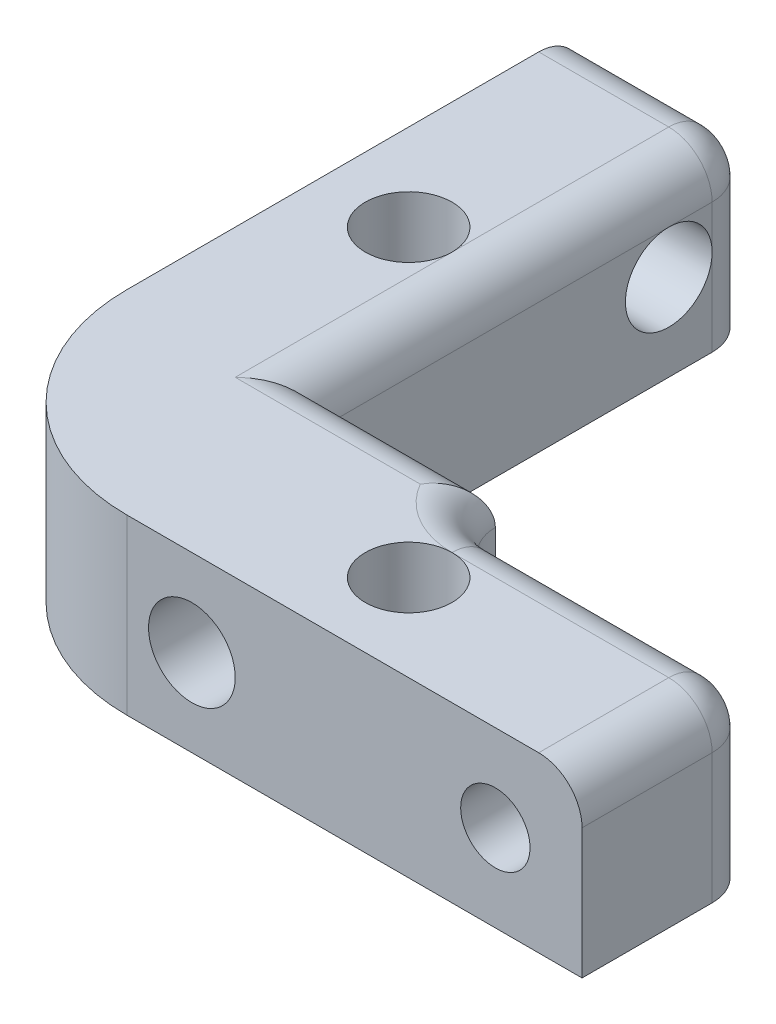
ISO-10303-21;
HEADER;
FILE_DESCRIPTION(('STEP AP214'),'2;1');
FILE_NAME('part.step','',(''),(''),'','','');
FILE_SCHEMA(('AUTOMOTIVE_DESIGN { 1 0 10303 214 1 1 1 1 }'));
ENDSEC;
DATA;
#1=APPLICATION_CONTEXT('core data for automotive mechanical design processes');
#2=APPLICATION_PROTOCOL_DEFINITION('international standard','automotive_design',2000,#1);
#3=PRODUCT_CONTEXT('',#1,'mechanical');
#4=PRODUCT('Part','Part','',(#3));
#5=PRODUCT_RELATED_PRODUCT_CATEGORY('part','',(#4));
#6=PRODUCT_DEFINITION_FORMATION('','',#4);
#7=PRODUCT_DEFINITION_CONTEXT('part definition',#1,'design');
#8=PRODUCT_DEFINITION('design','',#6,#7);
#9=PRODUCT_DEFINITION_SHAPE('','',#8);
#10=(LENGTH_UNIT() NAMED_UNIT(*) SI_UNIT(.MILLI.,.METRE.));
#11=(NAMED_UNIT(*) PLANE_ANGLE_UNIT() SI_UNIT($,.RADIAN.));
#12=(NAMED_UNIT(*) SI_UNIT($,.STERADIAN.) SOLID_ANGLE_UNIT());
#13=UNCERTAINTY_MEASURE_WITH_UNIT(LENGTH_MEASURE(1.E-05),#10,'distance_accuracy_value','');
#14=(GEOMETRIC_REPRESENTATION_CONTEXT(3) GLOBAL_UNCERTAINTY_ASSIGNED_CONTEXT((#13)) GLOBAL_UNIT_ASSIGNED_CONTEXT((#10,
#11,#12)) REPRESENTATION_CONTEXT('',''));
#15=CARTESIAN_POINT('',(0.,0.,0.));
#16=DIRECTION('',(0.,0.,1.));
#17=DIRECTION('',(1.,0.,0.));
#18=AXIS2_PLACEMENT_3D('',#15,#16,#17);
#19=CARTESIAN_POINT('',(0.,6.,-8.));
#20=DIRECTION('',(1.,0.,0.));
#21=DIRECTION('',(0.,0.,1.));
#22=AXIS2_PLACEMENT_3D('',#19,#20,#21);
#23=CYLINDRICAL_SURFACE('',#22,2.);
#24=CARTESIAN_POINT('',(6.,6.,-8.));
#25=DIRECTION('',(-0.707106781186547,0.,-0.707106781186548));
#26=DIRECTION('',(0.707106781186548,0.,-0.707106781186547));
#27=AXIS2_PLACEMENT_3D('',#24,#25,#26);
#28=ELLIPSE('',#27,2.82842712474619,2.);
#29=CARTESIAN_POINT('',(8.,6.,-10.));
#30=VERTEX_POINT('',#29);
#31=CARTESIAN_POINT('',(6.,8.,-8.));
#32=VERTEX_POINT('',#31);
#33=EDGE_CURVE('E179',#30,#32,#28,.F.);
#34=ORIENTED_EDGE('',*,*,#33,.T.);
#35=DIRECTION('',(-1.,0.,0.));
#36=VECTOR('',#35,1.);
#37=CARTESIAN_POINT('',(16.,8.,-8.));
#38=LINE('',#37,#36);
#39=CARTESIAN_POINT('',(14.5358983848622,8.,-8.));
#40=VERTEX_POINT('',#39);
#41=EDGE_CURVE('E348',#32,#40,#38,.F.);
#42=ORIENTED_EDGE('',*,*,#41,.T.);
#43=CARTESIAN_POINT('',(14.5358983848622,8.,-8.));
#44=CARTESIAN_POINT('',(14.5375001824375,8.00000002209721,-8.0027744178466));
#45=CARTESIAN_POINT('',(14.5391028942597,7.99999424836433,-8.00554847099654));
#46=CARTESIAN_POINT('',(14.625864841651,7.99936864803302,-8.15561478811584));
#47=CARTESIAN_POINT('',(14.7135730795539,7.98242889649205,-8.30181855401064));
#48=CARTESIAN_POINT('',(14.8914272804067,7.91775844511564,-8.58617890631636));
#49=CARTESIAN_POINT('',(14.9815813571992,7.86990895227149,-8.72430219466688));
#50=CARTESIAN_POINT('',(15.1518529762845,7.75186419444566,-8.97363448444823));
#51=CARTESIAN_POINT('',(15.2320382829593,7.68451386831143,-9.08614843543818));
#52=CARTESIAN_POINT('',(15.3890326338001,7.52787635455287,-9.29724182069926));
#53=CARTESIAN_POINT('',(15.465847178763,7.43862660343163,-9.39584458742172));
#54=CARTESIAN_POINT('',(15.5950234986144,7.26222042888166,-9.55481481391088));
#55=CARTESIAN_POINT('',(15.6489227442374,7.17938601622185,-9.61874492625438));
#56=CARTESIAN_POINT('',(15.7494480077157,7.00156465967341,-9.73438111148855));
#57=CARTESIAN_POINT('',(15.7960826121481,6.90659230801682,-9.78610165357081));
#58=CARTESIAN_POINT('',(15.8686073309647,6.7284656554436,-9.86454411726075));
#59=CARTESIAN_POINT('',(15.8968024290323,6.6475823092866,-9.8942783148596));
#60=CARTESIAN_POINT('',(15.9440557721517,6.48029934945976,-9.94341411816275));
#61=CARTESIAN_POINT('',(15.9631401555952,6.39391633226238,-9.96284530090678));
#62=CARTESIAN_POINT('',(15.9842872083708,6.25568014900519,-9.98424053448558));
#63=CARTESIAN_POINT('',(15.9901408879265,6.20497641338193,-9.99012309445256));
#64=CARTESIAN_POINT('',(15.9980134230023,6.10286316456792,-9.99801367061352));
#65=CARTESIAN_POINT('',(16.0000237902505,6.05145234115789,-10.0000131107714));
#66=CARTESIAN_POINT('',(16.,6.,-10.));
#67=B_SPLINE_CURVE_WITH_KNOTS('',3,(#43,#44,#45,#46,#47,#48,#49,#50,#51,#52,#53,#54,#55,#56,#57,
#58,#59,#60,#61,#62,#63,#64,#65,#66),.UNSPECIFIED.,.F.,.F.,(4,2,2,2,2,2,2,2,2,2,2,4),(0.,
0.00961126168696794,0.520007135459454,1.03237633923822,1.49140460861737,1.94965358203387,
2.30154353440882,2.65301435541076,2.92403339153315,3.19427013774113,3.34813507965423,
3.50233945415597),.UNSPECIFIED.);
#68=CARTESIAN_POINT('',(16.,6.,-10.));
#69=VERTEX_POINT('',#68);
#70=EDGE_CURVE('E12',#40,#69,#67,.T.);
#71=ORIENTED_EDGE('',*,*,#70,.T.);
#72=DIRECTION('',(-1.,0.,0.));
#73=VECTOR('',#72,1.);
#74=CARTESIAN_POINT('',(6.,6.,-10.));
#75=LINE('',#74,#73);
#76=EDGE_CURVE('E169',#69,#30,#75,.T.);
#77=ORIENTED_EDGE('',*,*,#76,.T.);
#78=EDGE_LOOP('',(#34,#42,#71,#77));
#79=FACE_BOUND('',#78,.T.);
#80=ADVANCED_FACE('F38',(#79),#23,.T.);
#81=CARTESIAN_POINT('',(18.,6.,-10.));
#82=DIRECTION('',(0.,1.,0.));
#83=DIRECTION('',(0.,0.,-1.));
#84=AXIS2_PLACEMENT_3D('',#81,#82,#83);
#85=TOROIDAL_SURFACE('',#84,4.,2.);
#86=CARTESIAN_POINT('',(18.,8.,-10.));
#87=DIRECTION('',(0.,-1.,0.));
#88=DIRECTION('',(0.,0.,-1.));
#89=AXIS2_PLACEMENT_3D('',#86,#87,#88);
#90=CIRCLE('',#89,4.);
#91=CARTESIAN_POINT('',(18.,8.,-6.));
#92=VERTEX_POINT('',#91);
#93=EDGE_CURVE('E58',#92,#40,#90,.T.);
#94=ORIENTED_EDGE('',*,*,#93,.F.);
#95=CARTESIAN_POINT('',(18.,6.,-6.));
#96=DIRECTION('',(1.,0.,0.));
#97=DIRECTION('',(0.,0.,-1.));
#98=AXIS2_PLACEMENT_3D('',#95,#96,#97);
#99=CIRCLE('',#98,2.);
#100=CARTESIAN_POINT('',(18.,6.,-8.));
#101=VERTEX_POINT('',#100);
#102=EDGE_CURVE('E360',#92,#101,#99,.F.);
#103=ORIENTED_EDGE('',*,*,#102,.T.);
#104=CARTESIAN_POINT('',(18.,6.,-10.));
#105=DIRECTION('',(0.,-1.,0.));
#106=DIRECTION('',(0.,0.,-1.));
#107=AXIS2_PLACEMENT_3D('',#104,#105,#106);
#108=CIRCLE('',#107,2.);
#109=EDGE_CURVE('E331',#69,#101,#108,.F.);
#110=ORIENTED_EDGE('',*,*,#109,.F.);
#111=ORIENTED_EDGE('',*,*,#70,.F.);
#112=EDGE_LOOP('',(#94,#103,#110,#111));
#113=FACE_BOUND('',#112,.T.);
#114=ADVANCED_FACE('F364',(#113),#85,.T.);
#115=CARTESIAN_POINT('',(30.,8.,-8.));
#116=DIRECTION('',(0.,0.,-1.));
#117=DIRECTION('',(1.,0.,0.));
#118=AXIS2_PLACEMENT_3D('',#115,#116,#117);
#119=PLANE('',#118);
#120=DIRECTION('',(0.,-1.,0.));
#121=VECTOR('',#120,1.);
#122=CARTESIAN_POINT('',(28.,8.,-8.));
#123=LINE('',#122,#121);
#124=CARTESIAN_POINT('',(28.,4.,-8.));
#125=VERTEX_POINT('',#124);
#126=CARTESIAN_POINT('',(28.,6.,-8.));
#127=VERTEX_POINT('',#126);
#128=EDGE_CURVE('E292',#125,#127,#123,.F.);
#129=ORIENTED_EDGE('',*,*,#128,.F.);
#130=CARTESIAN_POINT('',(26.,4.,-8.));
#131=DIRECTION('',(0.,0.,1.));
#132=DIRECTION('',(1.,0.,0.));
#133=AXIS2_PLACEMENT_3D('',#130,#131,#132);
#134=CIRCLE('',#133,2.);
#135=CARTESIAN_POINT('',(26.,6.,-8.));
#136=VERTEX_POINT('',#135);
#137=EDGE_CURVE('E207',#125,#136,#134,.T.);
#138=ORIENTED_EDGE('',*,*,#137,.T.);
#139=DIRECTION('',(-1.,0.,0.));
#140=VECTOR('',#139,1.);
#141=CARTESIAN_POINT('',(30.,6.,-8.));
#142=LINE('',#141,#140);
#143=EDGE_CURVE('E345',#127,#136,#142,.T.);
#144=ORIENTED_EDGE('',*,*,#143,.F.);
#145=EDGE_LOOP('',(#129,#138,#144));
#146=FACE_BOUND('',#145,.T.);
#147=ADVANCED_FACE('F432',(#146),#119,.T.);
#148=CARTESIAN_POINT('',(8.,8.,-9.00000000000006));
#149=DIRECTION('',(1.,0.,0.));
#150=DIRECTION('',(0.,0.,1.));
#151=AXIS2_PLACEMENT_3D('',#148,#149,#150);
#152=PLANE('',#151);
#153=CARTESIAN_POINT('',(8.00000000000001,4.,-26.));
#154=DIRECTION('',(1.,0.,0.));
#155=DIRECTION('',(0.,0.,-1.));
#156=AXIS2_PLACEMENT_3D('',#153,#154,#155);
#157=CIRCLE('',#156,2.);
#158=CARTESIAN_POINT('',(8.00000000000001,6.,-26.));
#159=VERTEX_POINT('',#158);
#160=CARTESIAN_POINT('',(8.00000000000001,4.,-28.));
#161=VERTEX_POINT('',#160);
#162=EDGE_CURVE('E189',#159,#161,#157,.T.);
#163=ORIENTED_EDGE('',*,*,#162,.F.);
#164=DIRECTION('',(0.,0.,-1.));
#165=VECTOR('',#164,1.);
#166=CARTESIAN_POINT('',(8.,6.,-9.00000000000006));
#167=LINE('',#166,#165);
#168=EDGE_CURVE('E311',#30,#159,#167,.T.);
#169=ORIENTED_EDGE('',*,*,#168,.F.);
#170=DIRECTION('',(0.,-1.,0.));
#171=VECTOR('',#170,1.);
#172=CARTESIAN_POINT('',(8.,8.,-10.));
#173=LINE('',#172,#171);
#174=CARTESIAN_POINT('',(8.,0.,-10.));
#175=VERTEX_POINT('',#174);
#176=EDGE_CURVE('E187',#30,#175,#173,.T.);
#177=ORIENTED_EDGE('',*,*,#176,.T.);
#178=DIRECTION('',(0.,0.,-1.));
#179=VECTOR('',#178,1.);
#180=CARTESIAN_POINT('',(8.,0.,-9.00000000000006));
#181=LINE('',#180,#179);
#182=CARTESIAN_POINT('',(8.,0.,-28.));
#183=VERTEX_POINT('',#182);
#184=EDGE_CURVE('E185',#175,#183,#181,.T.);
#185=ORIENTED_EDGE('',*,*,#184,.T.);
#186=DIRECTION('',(0.,-1.,0.));
#187=VECTOR('',#186,1.);
#188=CARTESIAN_POINT('',(8.,8.,-28.));
#189=LINE('',#188,#187);
#190=EDGE_CURVE('E316',#161,#183,#189,.T.);
#191=ORIENTED_EDGE('',*,*,#190,.F.);
#192=EDGE_LOOP('',(#163,#169,#177,#185,#191));
#193=FACE_BOUND('',#192,.T.);
#194=ADVANCED_FACE('F408',(#193),#152,.T.);
#195=CARTESIAN_POINT('',(12.,4.,0.));
#196=DIRECTION('',(0.,0.,-1.));
#197=DIRECTION('',(1.,0.,0.));
#198=AXIS2_PLACEMENT_3D('',#195,#196,#197);
#199=CYLINDRICAL_SURFACE('',#198,1.6);
#200=CARTESIAN_POINT('',(12.,4.,-10.));
#201=DIRECTION('',(0.,0.,-1.));
#202=DIRECTION('',(-1.,0.,0.));
#203=AXIS2_PLACEMENT_3D('',#200,#201,#202);
#204=CIRCLE('',#203,1.6);
#205=CARTESIAN_POINT('',(10.4,4.,-10.));
#206=VERTEX_POINT('',#205);
#207=EDGE_CURVE('E170',#206,#206,#204,.T.);
#208=ORIENTED_EDGE('',*,*,#207,.T.);
#209=EDGE_LOOP('',(#208));
#210=FACE_BOUND('',#209,.T.);
#211=CARTESIAN_POINT('',(12.,4.,-7.5));
#212=DIRECTION('',(0.,0.,-1.));
#213=DIRECTION('',(-1.,0.,0.));
#214=AXIS2_PLACEMENT_3D('',#211,#212,#213);
#215=CIRCLE('',#214,1.6);
#216=CARTESIAN_POINT('',(10.4,4.,-7.5));
#217=VERTEX_POINT('',#216);
#218=EDGE_CURVE('E279',#217,#217,#215,.F.);
#219=ORIENTED_EDGE('',*,*,#218,.T.);
#220=EDGE_LOOP('',(#219));
#221=FACE_BOUND('',#220,.T.);
#222=ADVANCED_FACE('F741',(#210,#221),#199,.F.);
#223=DIRECTION('',(0.,0.,-1.));
#224=VECTOR('',#223,1.);
#225=CARTESIAN_POINT('',(8.,6.,-9.00000000000006));
#226=LINE('',#225,#224);
#227=CARTESIAN_POINT('',(8.,6.,-28.));
#228=VERTEX_POINT('',#227);
#229=EDGE_CURVE('E308',#159,#228,#226,.T.);
#230=ORIENTED_EDGE('',*,*,#229,.F.);
#231=EDGE_CURVE('E197',#161,#159,#157,.T.);
#232=ORIENTED_EDGE('',*,*,#231,.F.);
#233=DIRECTION('',(0.,-1.,0.));
#234=VECTOR('',#233,1.);
#235=CARTESIAN_POINT('',(8.,8.,-28.));
#236=LINE('',#235,#234);
#237=EDGE_CURVE('E314',#228,#161,#236,.T.);
#238=ORIENTED_EDGE('',*,*,#237,.F.);
#239=EDGE_LOOP('',(#230,#232,#238));
#240=FACE_BOUND('',#239,.T.);
#241=ADVANCED_FACE('F743',(#240),#152,.T.);
#242=CARTESIAN_POINT('',(30.001,4.,-26.));
#243=DIRECTION('',(-1.,0.,0.));
#244=DIRECTION('',(0.,0.,-1.));
#245=AXIS2_PLACEMENT_3D('',#242,#243,#244);
#246=CYLINDRICAL_SURFACE('',#245,1.6);
#247=CARTESIAN_POINT('',(0.,4.,-26.));
#248=DIRECTION('',(-1.,0.,0.));
#249=DIRECTION('',(0.,0.,1.));
#250=AXIS2_PLACEMENT_3D('',#247,#248,#249);
#251=CIRCLE('',#250,1.6);
#252=CARTESIAN_POINT('',(0.,4.,-24.4));
#253=VERTEX_POINT('',#252);
#254=EDGE_CURVE('E199',#253,#253,#251,.T.);
#255=ORIENTED_EDGE('',*,*,#254,.T.);
#256=EDGE_LOOP('',(#255));
#257=FACE_BOUND('',#256,.T.);
#258=CARTESIAN_POINT('',(2.50000000000001,4.,-26.));
#259=DIRECTION('',(-1.,0.,0.));
#260=DIRECTION('',(0.,0.,1.));
#261=AXIS2_PLACEMENT_3D('',#258,#259,#260);
#262=CIRCLE('',#261,1.6);
#263=CARTESIAN_POINT('',(2.50000000000001,4.,-24.4));
#264=VERTEX_POINT('',#263);
#265=EDGE_CURVE('E196',#264,#264,#262,.T.);
#266=ORIENTED_EDGE('',*,*,#265,.F.);
#267=EDGE_LOOP('',(#266));
#268=FACE_BOUND('',#267,.T.);
#269=ADVANCED_FACE('F493',(#257,#268),#246,.F.);
#270=CARTESIAN_POINT('',(26.,4.,-30.001));
#271=DIRECTION('',(0.,0.,1.));
#272=DIRECTION('',(-1.,0.,0.));
#273=AXIS2_PLACEMENT_3D('',#270,#271,#272);
#274=CYLINDRICAL_SURFACE('',#273,1.6);
#275=CARTESIAN_POINT('',(26.,4.,0.));
#276=DIRECTION('',(0.,0.,-1.));
#277=DIRECTION('',(-1.,0.,0.));
#278=AXIS2_PLACEMENT_3D('',#275,#276,#277);
#279=CIRCLE('',#278,1.6);
#280=CARTESIAN_POINT('',(24.4,4.,0.));
#281=VERTEX_POINT('',#280);
#282=EDGE_CURVE('E210',#281,#281,#279,.T.);
#283=ORIENTED_EDGE('',*,*,#282,.F.);
#284=EDGE_LOOP('',(#283));
#285=FACE_BOUND('',#284,.T.);
#286=CARTESIAN_POINT('',(26.,4.,-2.5));
#287=DIRECTION('',(0.,0.,1.));
#288=DIRECTION('',(1.,0.,0.));
#289=AXIS2_PLACEMENT_3D('',#286,#287,#288);
#290=CIRCLE('',#289,1.6);
#291=CARTESIAN_POINT('',(27.6,4.,-2.5));
#292=VERTEX_POINT('',#291);
#293=EDGE_CURVE('E206',#292,#292,#290,.F.);
#294=ORIENTED_EDGE('',*,*,#293,.T.);
#295=EDGE_LOOP('',(#294));
#296=FACE_BOUND('',#295,.T.);
#297=ADVANCED_FACE('F489',(#285,#296),#274,.F.);
#298=CARTESIAN_POINT('',(4.00000000000001,8.001,-18.));
#299=DIRECTION('',(0.,-1.,0.));
#300=DIRECTION('',(0.,0.,1.));
#301=AXIS2_PLACEMENT_3D('',#298,#299,#300);
#302=CYLINDRICAL_SURFACE('',#301,1.6);
#303=CARTESIAN_POINT('',(4.00000000000001,0.,-18.));
#304=DIRECTION('',(0.,1.,0.));
#305=DIRECTION('',(0.,0.,1.));
#306=AXIS2_PLACEMENT_3D('',#303,#304,#305);
#307=CIRCLE('',#306,1.6);
#308=CARTESIAN_POINT('',(4.00000000000001,0.,-16.4));
#309=VERTEX_POINT('',#308);
#310=EDGE_CURVE('E229',#309,#309,#307,.T.);
#311=ORIENTED_EDGE('',*,*,#310,.F.);
#312=EDGE_LOOP('',(#311));
#313=FACE_BOUND('',#312,.T.);
#314=CARTESIAN_POINT('',(4.00000000000001,2.5,-18.));
#315=DIRECTION('',(0.,-1.,0.));
#316=DIRECTION('',(0.,0.,-1.));
#317=AXIS2_PLACEMENT_3D('',#314,#315,#316);
#318=CIRCLE('',#317,1.6);
#319=CARTESIAN_POINT('',(4.00000000000001,2.5,-19.6));
#320=VERTEX_POINT('',#319);
#321=EDGE_CURVE('E232',#320,#320,#318,.F.);
#322=ORIENTED_EDGE('',*,*,#321,.T.);
#323=EDGE_LOOP('',(#322));
#324=FACE_BOUND('',#323,.T.);
#325=ADVANCED_FACE('F492',(#313,#324),#302,.F.);
#326=CARTESIAN_POINT('',(18.,8.001,-4.));
#327=DIRECTION('',(0.,-1.,0.));
#328=DIRECTION('',(0.,0.,1.));
#329=AXIS2_PLACEMENT_3D('',#326,#327,#328);
#330=CYLINDRICAL_SURFACE('',#329,1.6);
#331=CARTESIAN_POINT('',(18.,0.,-4.));
#332=DIRECTION('',(0.,1.,0.));
#333=DIRECTION('',(0.,0.,1.));
#334=AXIS2_PLACEMENT_3D('',#331,#332,#333);
#335=CIRCLE('',#334,1.6);
#336=CARTESIAN_POINT('',(18.,0.,-2.4));
#337=VERTEX_POINT('',#336);
#338=EDGE_CURVE('E225',#337,#337,#335,.T.);
#339=ORIENTED_EDGE('',*,*,#338,.F.);
#340=EDGE_LOOP('',(#339));
#341=FACE_BOUND('',#340,.T.);
#342=CARTESIAN_POINT('',(18.,2.5,-4.));
#343=DIRECTION('',(0.,-1.,0.));
#344=DIRECTION('',(0.,0.,-1.));
#345=AXIS2_PLACEMENT_3D('',#342,#343,#344);
#346=CIRCLE('',#345,1.6);
#347=CARTESIAN_POINT('',(18.,2.5,-5.6));
#348=VERTEX_POINT('',#347);
#349=EDGE_CURVE('E217',#348,#348,#346,.F.);
#350=ORIENTED_EDGE('',*,*,#349,.T.);
#351=EDGE_LOOP('',(#350));
#352=FACE_BOUND('',#351,.T.);
#353=ADVANCED_FACE('F509',(#341,#352),#330,.F.);
#354=CARTESIAN_POINT('',(0.,8.,-9.00000000000006));
#355=DIRECTION('',(1.,0.,0.));
#356=DIRECTION('',(0.,0.,1.));
#357=AXIS2_PLACEMENT_3D('',#354,#355,#356);
#358=PLANE('',#357);
#359=ORIENTED_EDGE('',*,*,#254,.F.);
#360=EDGE_LOOP('',(#359));
#361=FACE_BOUND('',#360,.T.);
#362=DIRECTION('',(0.,-1.,0.));
#363=VECTOR('',#362,1.);
#364=CARTESIAN_POINT('',(0.,8.,-30.));
#365=LINE('',#364,#363);
#366=CARTESIAN_POINT('',(0.,6.,-30.));
#367=VERTEX_POINT('',#366);
#368=CARTESIAN_POINT('',(0.,0.,-30.));
#369=VERTEX_POINT('',#368);
#370=EDGE_CURVE('E265',#367,#369,#365,.T.);
#371=ORIENTED_EDGE('',*,*,#370,.T.);
#372=DIRECTION('',(0.,0.,-1.));
#373=VECTOR('',#372,1.);
#374=CARTESIAN_POINT('',(0.,0.,-9.00000000000006));
#375=LINE('',#374,#373);
#376=CARTESIAN_POINT('',(0.,0.,-9.00000000000006));
#377=VERTEX_POINT('',#376);
#378=EDGE_CURVE('E228',#377,#369,#375,.T.);
#379=ORIENTED_EDGE('',*,*,#378,.F.);
#380=DIRECTION('',(0.,-1.,0.));
#381=VECTOR('',#380,1.);
#382=CARTESIAN_POINT('',(0.,8.,-9.00000000000006));
#383=LINE('',#382,#381);
#384=CARTESIAN_POINT('',(0.,8.,-9.00000000000006));
#385=VERTEX_POINT('',#384);
#386=EDGE_CURVE('E242',#385,#377,#383,.T.);
#387=ORIENTED_EDGE('',*,*,#386,.F.);
#388=DIRECTION('',(0.,0.,-1.));
#389=VECTOR('',#388,1.);
#390=CARTESIAN_POINT('',(0.,8.,-9.00000000000006));
#391=LINE('',#390,#389);
#392=CARTESIAN_POINT('',(0.,8.,-28.));
#393=VERTEX_POINT('',#392);
#394=EDGE_CURVE('E233',#385,#393,#391,.T.);
#395=ORIENTED_EDGE('',*,*,#394,.T.);
#396=CARTESIAN_POINT('',(0.,6.,-28.));
#397=DIRECTION('',(-1.,0.,0.));
#398=DIRECTION('',(0.,0.,1.));
#399=AXIS2_PLACEMENT_3D('',#396,#397,#398);
#400=CIRCLE('',#399,2.);
#401=EDGE_CURVE('E324',#367,#393,#400,.F.);
#402=ORIENTED_EDGE('',*,*,#401,.F.);
#403=EDGE_LOOP('',(#371,#379,#387,#395,#402));
#404=FACE_BOUND('',#403,.T.);
#405=ADVANCED_FACE('F393',(#361,#404),#358,.F.);
#406=CARTESIAN_POINT('',(8.,8.,-30.));
#407=DIRECTION('',(0.,0.,-1.));
#408=DIRECTION('',(1.,0.,0.));
#409=AXIS2_PLACEMENT_3D('',#406,#407,#408);
#410=PLANE('',#409);
#411=DIRECTION('',(-1.,0.,0.));
#412=VECTOR('',#411,1.);
#413=CARTESIAN_POINT('',(8.,0.,-30.));
#414=LINE('',#413,#412);
#415=CARTESIAN_POINT('',(6.,0.,-30.));
#416=VERTEX_POINT('',#415);
#417=EDGE_CURVE('E245',#416,#369,#414,.T.);
#418=ORIENTED_EDGE('',*,*,#417,.T.);
#419=ORIENTED_EDGE('',*,*,#370,.F.);
#420=DIRECTION('',(-1.,0.,0.));
#421=VECTOR('',#420,1.);
#422=CARTESIAN_POINT('',(8.,6.,-30.));
#423=LINE('',#422,#421);
#424=CARTESIAN_POINT('',(6.,6.,-30.));
#425=VERTEX_POINT('',#424);
#426=EDGE_CURVE('E319',#425,#367,#423,.T.);
#427=ORIENTED_EDGE('',*,*,#426,.F.);
#428=DIRECTION('',(0.,-1.,0.));
#429=VECTOR('',#428,1.);
#430=CARTESIAN_POINT('',(6.,8.,-30.));
#431=LINE('',#430,#429);
#432=EDGE_CURVE('E321',#416,#425,#431,.F.);
#433=ORIENTED_EDGE('',*,*,#432,.F.);
#434=EDGE_LOOP('',(#418,#419,#427,#433));
#435=FACE_BOUND('',#434,.T.);
#436=ADVANCED_FACE('F398',(#435),#410,.T.);
#437=EDGE_CURVE('E202',#136,#125,#134,.T.);
#438=ORIENTED_EDGE('',*,*,#437,.T.);
#439=DIRECTION('',(0.,-1.,0.));
#440=VECTOR('',#439,1.);
#441=CARTESIAN_POINT('',(28.,8.,-8.));
#442=LINE('',#441,#440);
#443=CARTESIAN_POINT('',(28.,0.,-8.));
#444=VERTEX_POINT('',#443);
#445=EDGE_CURVE('E295',#444,#125,#442,.F.);
#446=ORIENTED_EDGE('',*,*,#445,.F.);
#447=DIRECTION('',(-1.,0.,0.));
#448=VECTOR('',#447,1.);
#449=CARTESIAN_POINT('',(30.,0.,-8.));
#450=LINE('',#449,#448);
#451=CARTESIAN_POINT('',(18.,0.,-8.));
#452=VERTEX_POINT('',#451);
#453=EDGE_CURVE('E248',#444,#452,#450,.T.);
#454=ORIENTED_EDGE('',*,*,#453,.T.);
#455=DIRECTION('',(0.,-1.,0.));
#456=VECTOR('',#455,1.);
#457=CARTESIAN_POINT('',(18.,0.,-8.));
#458=LINE('',#457,#456);
#459=EDGE_CURVE('E175',#101,#452,#458,.T.);
#460=ORIENTED_EDGE('',*,*,#459,.F.);
#461=DIRECTION('',(-1.,0.,0.));
#462=VECTOR('',#461,1.);
#463=CARTESIAN_POINT('',(30.,6.,-8.));
#464=LINE('',#463,#462);
#465=EDGE_CURVE('E343',#136,#101,#464,.T.);
#466=ORIENTED_EDGE('',*,*,#465,.F.);
#467=EDGE_LOOP('',(#438,#446,#454,#460,#466));
#468=FACE_BOUND('',#467,.T.);
#469=ADVANCED_FACE('F372',(#468),#119,.T.);
#470=CARTESIAN_POINT('',(30.,8.,0.));
#471=DIRECTION('',(1.,0.,0.));
#472=DIRECTION('',(0.,0.,1.));
#473=AXIS2_PLACEMENT_3D('',#470,#471,#472);
#474=PLANE('',#473);
#475=DIRECTION('',(0.,0.,-1.));
#476=VECTOR('',#475,1.);
#477=CARTESIAN_POINT('',(30.,6.,0.));
#478=LINE('',#477,#476);
#479=CARTESIAN_POINT('',(30.,6.,0.));
#480=VERTEX_POINT('',#479);
#481=CARTESIAN_POINT('',(30.,6.,-6.));
#482=VERTEX_POINT('',#481);
#483=EDGE_CURVE('E268',#480,#482,#478,.T.);
#484=ORIENTED_EDGE('',*,*,#483,.F.);
#485=DIRECTION('',(0.,-1.,0.));
#486=VECTOR('',#485,1.);
#487=CARTESIAN_POINT('',(30.,8.,0.));
#488=LINE('',#487,#486);
#489=CARTESIAN_POINT('',(30.,0.,0.));
#490=VERTEX_POINT('',#489);
#491=EDGE_CURVE('E262',#480,#490,#488,.T.);
#492=ORIENTED_EDGE('',*,*,#491,.T.);
#493=DIRECTION('',(0.,0.,-1.));
#494=VECTOR('',#493,1.);
#495=CARTESIAN_POINT('',(30.,0.,0.));
#496=LINE('',#495,#494);
#497=CARTESIAN_POINT('',(30.,0.,-6.));
#498=VERTEX_POINT('',#497);
#499=EDGE_CURVE('E250',#490,#498,#496,.T.);
#500=ORIENTED_EDGE('',*,*,#499,.T.);
#501=DIRECTION('',(0.,-1.,0.));
#502=VECTOR('',#501,1.);
#503=CARTESIAN_POINT('',(30.,8.,-6.));
#504=LINE('',#503,#502);
#505=EDGE_CURVE('E285',#482,#498,#504,.T.);
#506=ORIENTED_EDGE('',*,*,#505,.F.);
#507=EDGE_LOOP('',(#484,#492,#500,#506));
#508=FACE_BOUND('',#507,.T.);
#509=ADVANCED_FACE('F379',(#508),#474,.T.);
#510=CARTESIAN_POINT('',(30.,8.,0.));
#511=DIRECTION('',(0.,0.,-1.));
#512=DIRECTION('',(1.,0.,0.));
#513=AXIS2_PLACEMENT_3D('',#510,#511,#512);
#514=PLANE('',#513);
#515=CARTESIAN_POINT('',(12.,4.,0.));
#516=DIRECTION('',(0.,0.,1.));
#517=DIRECTION('',(1.,0.,0.));
#518=AXIS2_PLACEMENT_3D('',#515,#516,#517);
#519=CIRCLE('',#518,2.);
#520=CARTESIAN_POINT('',(14.,4.,0.));
#521=VERTEX_POINT('',#520);
#522=EDGE_CURVE('E336',#521,#521,#519,.T.);
#523=ORIENTED_EDGE('',*,*,#522,.F.);
#524=EDGE_LOOP('',(#523));
#525=FACE_BOUND('',#524,.T.);
#526=ORIENTED_EDGE('',*,*,#282,.T.);
#527=EDGE_LOOP('',(#526));
#528=FACE_BOUND('',#527,.T.);
#529=DIRECTION('',(-1.,0.,0.));
#530=VECTOR('',#529,1.);
#531=CARTESIAN_POINT('',(30.,8.,0.));
#532=LINE('',#531,#530);
#533=CARTESIAN_POINT('',(28.,8.,0.));
#534=VERTEX_POINT('',#533);
#535=CARTESIAN_POINT('',(9.00000000000006,8.,0.));
#536=VERTEX_POINT('',#535);
#537=EDGE_CURVE('E236',#534,#536,#532,.T.);
#538=ORIENTED_EDGE('',*,*,#537,.T.);
#539=DIRECTION('',(0.,-1.,0.));
#540=VECTOR('',#539,1.);
#541=CARTESIAN_POINT('',(9.00000000000006,8.,0.));
#542=LINE('',#541,#540);
#543=CARTESIAN_POINT('',(9.00000000000006,0.,0.));
#544=VERTEX_POINT('',#543);
#545=EDGE_CURVE('E259',#536,#544,#542,.T.);
#546=ORIENTED_EDGE('',*,*,#545,.T.);
#547=DIRECTION('',(-1.,0.,0.));
#548=VECTOR('',#547,1.);
#549=CARTESIAN_POINT('',(30.,0.,0.));
#550=LINE('',#549,#548);
#551=EDGE_CURVE('E253',#490,#544,#550,.T.);
#552=ORIENTED_EDGE('',*,*,#551,.F.);
#553=ORIENTED_EDGE('',*,*,#491,.F.);
#554=CARTESIAN_POINT('',(28.,6.,0.));
#555=DIRECTION('',(0.,0.,1.));
#556=DIRECTION('',(1.,0.,0.));
#557=AXIS2_PLACEMENT_3D('',#554,#555,#556);
#558=CIRCLE('',#557,2.);
#559=EDGE_CURVE('E306',#534,#480,#558,.F.);
#560=ORIENTED_EDGE('',*,*,#559,.F.);
#561=EDGE_LOOP('',(#538,#546,#552,#553,#560));
#562=FACE_BOUND('',#561,.T.);
#563=ADVANCED_FACE('F383',(#525,#528,#562),#514,.F.);
#564=CARTESIAN_POINT('',(9.,8.,-9.));
#565=DIRECTION('',(0.,-1.,0.));
#566=DIRECTION('',(0.,0.,1.));
#567=AXIS2_PLACEMENT_3D('',#564,#565,#566);
#568=CYLINDRICAL_SURFACE('',#567,9.);
#569=CARTESIAN_POINT('',(9.,0.,-9.));
#570=DIRECTION('',(0.,-1.,0.));
#571=DIRECTION('',(0.,0.,-1.));
#572=AXIS2_PLACEMENT_3D('',#569,#570,#571);
#573=CIRCLE('',#572,9.);
#574=EDGE_CURVE('E237',#544,#377,#573,.T.);
#575=ORIENTED_EDGE('',*,*,#574,.F.);
#576=ORIENTED_EDGE('',*,*,#545,.F.);
#577=CARTESIAN_POINT('',(9.,8.,-9.));
#578=DIRECTION('',(0.,-1.,0.));
#579=DIRECTION('',(0.,0.,-1.));
#580=AXIS2_PLACEMENT_3D('',#577,#578,#579);
#581=CIRCLE('',#580,9.);
#582=EDGE_CURVE('E240',#536,#385,#581,.T.);
#583=ORIENTED_EDGE('',*,*,#582,.T.);
#584=ORIENTED_EDGE('',*,*,#386,.T.);
#585=EDGE_LOOP('',(#575,#576,#583,#584));
#586=FACE_BOUND('',#585,.T.);
#587=ADVANCED_FACE('F390',(#586),#568,.T.);
#588=CARTESIAN_POINT('',(9.,8.,-9.));
#589=DIRECTION('',(0.,1.,0.));
#590=DIRECTION('',(1.,0.,0.));
#591=AXIS2_PLACEMENT_3D('',#588,#589,#590);
#592=PLANE('',#591);
#593=CARTESIAN_POINT('',(18.,8.,-4.));
#594=DIRECTION('',(0.,-1.,0.));
#595=DIRECTION('',(0.,0.,-1.));
#596=AXIS2_PLACEMENT_3D('',#593,#594,#595);
#597=CIRCLE('',#596,2.);
#598=EDGE_CURVE('E213',#92,#92,#597,.T.);
#599=ORIENTED_EDGE('',*,*,#598,.T.);
#600=ORIENTED_EDGE('',*,*,#93,.T.);
#601=ORIENTED_EDGE('',*,*,#41,.F.);
#602=DIRECTION('',(0.,0.,-1.));
#603=VECTOR('',#602,1.);
#604=CARTESIAN_POINT('',(6.,8.,-9.));
#605=LINE('',#604,#603);
#606=CARTESIAN_POINT('',(6.,8.,-18.));
#607=VERTEX_POINT('',#606);
#608=EDGE_CURVE('E297',#607,#32,#605,.F.);
#609=ORIENTED_EDGE('',*,*,#608,.F.);
#610=CARTESIAN_POINT('',(4.00000000000001,8.,-18.));
#611=DIRECTION('',(0.,-1.,0.));
#612=DIRECTION('',(0.,0.,-1.));
#613=AXIS2_PLACEMENT_3D('',#610,#611,#612);
#614=CIRCLE('',#613,2.);
#615=EDGE_CURVE('E218',#607,#607,#614,.T.);
#616=ORIENTED_EDGE('',*,*,#615,.T.);
#617=DIRECTION('',(0.,0.,-1.));
#618=VECTOR('',#617,1.);
#619=CARTESIAN_POINT('',(6.,8.,-9.));
#620=LINE('',#619,#618);
#621=CARTESIAN_POINT('',(6.,8.,-28.));
#622=VERTEX_POINT('',#621);
#623=EDGE_CURVE('E299',#622,#607,#620,.F.);
#624=ORIENTED_EDGE('',*,*,#623,.F.);
#625=DIRECTION('',(-1.,0.,0.));
#626=VECTOR('',#625,1.);
#627=CARTESIAN_POINT('',(9.,8.,-28.));
#628=LINE('',#627,#626);
#629=EDGE_CURVE('E301',#393,#622,#628,.F.);
#630=ORIENTED_EDGE('',*,*,#629,.F.);
#631=ORIENTED_EDGE('',*,*,#394,.F.);
#632=ORIENTED_EDGE('',*,*,#582,.F.);
#633=ORIENTED_EDGE('',*,*,#537,.F.);
#634=DIRECTION('',(0.,0.,-1.));
#635=VECTOR('',#634,1.);
#636=CARTESIAN_POINT('',(28.,8.,-9.));
#637=LINE('',#636,#635);
#638=CARTESIAN_POINT('',(28.,8.,-6.));
#639=VERTEX_POINT('',#638);
#640=EDGE_CURVE('E304',#639,#534,#637,.F.);
#641=ORIENTED_EDGE('',*,*,#640,.F.);
#642=DIRECTION('',(-1.,0.,0.));
#643=VECTOR('',#642,1.);
#644=CARTESIAN_POINT('',(9.,8.,-6.));
#645=LINE('',#644,#643);
#646=EDGE_CURVE('E352',#92,#639,#645,.F.);
#647=ORIENTED_EDGE('',*,*,#646,.F.);
#648=EDGE_LOOP('',(#599,#600,#601,#609,#616,#624,#630,#631,#632,#633,#641,#647));
#649=FACE_BOUND('',#648,.T.);
#650=ADVANCED_FACE('F416',(#649),#592,.T.);
#651=CARTESIAN_POINT('',(9.,0.,-9.));
#652=DIRECTION('',(0.,1.,0.));
#653=DIRECTION('',(1.,0.,0.));
#654=AXIS2_PLACEMENT_3D('',#651,#652,#653);
#655=PLANE('',#654);
#656=ORIENTED_EDGE('',*,*,#499,.F.);
#657=ORIENTED_EDGE('',*,*,#551,.T.);
#658=ORIENTED_EDGE('',*,*,#574,.T.);
#659=ORIENTED_EDGE('',*,*,#378,.T.);
#660=ORIENTED_EDGE('',*,*,#417,.F.);
#661=CARTESIAN_POINT('',(6.,0.,-28.));
#662=DIRECTION('',(0.,-1.,0.));
#663=DIRECTION('',(0.,0.,-1.));
#664=AXIS2_PLACEMENT_3D('',#661,#662,#663);
#665=CIRCLE('',#664,2.);
#666=EDGE_CURVE('E288',#183,#416,#665,.F.);
#667=ORIENTED_EDGE('',*,*,#666,.F.);
#668=ORIENTED_EDGE('',*,*,#184,.F.);
#669=DIRECTION('',(-1.,0.,0.));
#670=VECTOR('',#669,1.);
#671=CARTESIAN_POINT('',(16.,0.,-10.));
#672=LINE('',#671,#670);
#673=CARTESIAN_POINT('',(16.,0.,-10.));
#674=VERTEX_POINT('',#673);
#675=EDGE_CURVE('E166',#674,#175,#672,.T.);
#676=ORIENTED_EDGE('',*,*,#675,.F.);
#677=CARTESIAN_POINT('',(18.,0.,-10.));
#678=DIRECTION('',(0.,-1.,0.));
#679=DIRECTION('',(0.,0.,-1.));
#680=AXIS2_PLACEMENT_3D('',#677,#678,#679);
#681=CIRCLE('',#680,2.);
#682=EDGE_CURVE('E51',#452,#674,#681,.T.);
#683=ORIENTED_EDGE('',*,*,#682,.F.);
#684=ORIENTED_EDGE('',*,*,#453,.F.);
#685=CARTESIAN_POINT('',(28.,0.,-6.));
#686=DIRECTION('',(0.,-1.,0.));
#687=DIRECTION('',(0.,0.,-1.));
#688=AXIS2_PLACEMENT_3D('',#685,#686,#687);
#689=CIRCLE('',#688,2.);
#690=EDGE_CURVE('E290',#498,#444,#689,.F.);
#691=ORIENTED_EDGE('',*,*,#690,.F.);
#692=EDGE_LOOP('',(#656,#657,#658,#659,#660,#667,#668,#676,#683,#684,#691));
#693=FACE_BOUND('',#692,.T.);
#694=ORIENTED_EDGE('',*,*,#310,.T.);
#695=EDGE_LOOP('',(#694));
#696=FACE_BOUND('',#695,.T.);
#697=ORIENTED_EDGE('',*,*,#338,.T.);
#698=EDGE_LOOP('',(#697));
#699=FACE_BOUND('',#698,.T.);
#700=ADVANCED_FACE('F182',(#693,#696,#699),#655,.F.);
#701=CARTESIAN_POINT('',(18.,2.5,-4.));
#702=DIRECTION('',(0.,1.,0.));
#703=DIRECTION('',(0.,0.,-1.));
#704=AXIS2_PLACEMENT_3D('',#701,#702,#703);
#705=PLANE('',#704);
#706=CARTESIAN_POINT('',(18.,2.5,-4.));
#707=DIRECTION('',(0.,-1.,0.));
#708=DIRECTION('',(0.,0.,-1.));
#709=AXIS2_PLACEMENT_3D('',#706,#707,#708);
#710=CIRCLE('',#709,2.);
#711=CARTESIAN_POINT('',(18.,2.5,-6.));
#712=VERTEX_POINT('',#711);
#713=EDGE_CURVE('E221',#712,#712,#710,.T.);
#714=ORIENTED_EDGE('',*,*,#713,.F.);
#715=EDGE_LOOP('',(#714));
#716=FACE_BOUND('',#715,.T.);
#717=ORIENTED_EDGE('',*,*,#349,.F.);
#718=EDGE_LOOP('',(#717));
#719=FACE_BOUND('',#718,.T.);
#720=ADVANCED_FACE('F424',(#716,#719),#705,.T.);
#721=CARTESIAN_POINT('',(18.,2.5,-4.));
#722=DIRECTION('',(0.,1.,0.));
#723=DIRECTION('',(0.,0.,-1.));
#724=AXIS2_PLACEMENT_3D('',#721,#722,#723);
#725=CYLINDRICAL_SURFACE('',#724,2.);
#726=ORIENTED_EDGE('',*,*,#713,.T.);
#727=EDGE_LOOP('',(#726));
#728=FACE_BOUND('',#727,.T.);
#729=ORIENTED_EDGE('',*,*,#598,.F.);
#730=EDGE_LOOP('',(#729));
#731=FACE_BOUND('',#730,.T.);
#732=ADVANCED_FACE('F498',(#728,#731),#725,.F.);
#733=CARTESIAN_POINT('',(4.00000000000001,2.5,-18.));
#734=DIRECTION('',(0.,1.,0.));
#735=DIRECTION('',(0.,0.,-1.));
#736=AXIS2_PLACEMENT_3D('',#733,#734,#735);
#737=PLANE('',#736);
#738=CARTESIAN_POINT('',(4.00000000000001,2.5,-18.));
#739=DIRECTION('',(0.,-1.,0.));
#740=DIRECTION('',(0.,0.,-1.));
#741=AXIS2_PLACEMENT_3D('',#738,#739,#740);
#742=CIRCLE('',#741,2.);
#743=CARTESIAN_POINT('',(4.00000000000001,2.5,-20.));
#744=VERTEX_POINT('',#743);
#745=EDGE_CURVE('E214',#744,#744,#742,.T.);
#746=ORIENTED_EDGE('',*,*,#745,.F.);
#747=EDGE_LOOP('',(#746));
#748=FACE_BOUND('',#747,.T.);
#749=ORIENTED_EDGE('',*,*,#321,.F.);
#750=EDGE_LOOP('',(#749));
#751=FACE_BOUND('',#750,.T.);
#752=ADVANCED_FACE('F495',(#748,#751),#737,.T.);
#753=CARTESIAN_POINT('',(4.00000000000001,2.5,-18.));
#754=DIRECTION('',(0.,1.,0.));
#755=DIRECTION('',(0.,0.,-1.));
#756=AXIS2_PLACEMENT_3D('',#753,#754,#755);
#757=CYLINDRICAL_SURFACE('',#756,2.);
#758=ORIENTED_EDGE('',*,*,#745,.T.);
#759=EDGE_LOOP('',(#758));
#760=FACE_BOUND('',#759,.T.);
#761=ORIENTED_EDGE('',*,*,#615,.F.);
#762=EDGE_LOOP('',(#761));
#763=FACE_BOUND('',#762,.T.);
#764=ADVANCED_FACE('F484',(#760,#763),#757,.F.);
#765=CARTESIAN_POINT('',(26.,4.,-2.5));
#766=DIRECTION('',(0.,0.,-1.));
#767=DIRECTION('',(1.,0.,0.));
#768=AXIS2_PLACEMENT_3D('',#765,#766,#767);
#769=PLANE('',#768);
#770=CARTESIAN_POINT('',(26.,4.,-2.5));
#771=DIRECTION('',(0.,0.,1.));
#772=DIRECTION('',(1.,0.,0.));
#773=AXIS2_PLACEMENT_3D('',#770,#771,#772);
#774=CIRCLE('',#773,2.);
#775=CARTESIAN_POINT('',(28.,4.,-2.5));
#776=VERTEX_POINT('',#775);
#777=EDGE_CURVE('E203',#776,#776,#774,.T.);
#778=ORIENTED_EDGE('',*,*,#777,.F.);
#779=EDGE_LOOP('',(#778));
#780=FACE_BOUND('',#779,.T.);
#781=ORIENTED_EDGE('',*,*,#293,.F.);
#782=EDGE_LOOP('',(#781));
#783=FACE_BOUND('',#782,.T.);
#784=ADVANCED_FACE('F474',(#780,#783),#769,.T.);
#785=CARTESIAN_POINT('',(26.,4.,-2.5));
#786=DIRECTION('',(0.,0.,-1.));
#787=DIRECTION('',(1.,0.,0.));
#788=AXIS2_PLACEMENT_3D('',#785,#786,#787);
#789=CYLINDRICAL_SURFACE('',#788,2.);
#790=ORIENTED_EDGE('',*,*,#777,.T.);
#791=EDGE_LOOP('',(#790));
#792=FACE_BOUND('',#791,.T.);
#793=ORIENTED_EDGE('',*,*,#137,.F.);
#794=ORIENTED_EDGE('',*,*,#437,.F.);
#795=EDGE_LOOP('',(#793,#794));
#796=FACE_BOUND('',#795,.T.);
#797=ADVANCED_FACE('F471',(#792,#796),#789,.F.);
#798=CARTESIAN_POINT('',(2.50000000000001,4.,-26.));
#799=DIRECTION('',(1.,0.,0.));
#800=DIRECTION('',(0.,0.,1.));
#801=AXIS2_PLACEMENT_3D('',#798,#799,#800);
#802=CYLINDRICAL_SURFACE('',#801,2.);
#803=CARTESIAN_POINT('',(2.50000000000001,4.,-26.));
#804=DIRECTION('',(1.,0.,0.));
#805=DIRECTION('',(0.,0.,-1.));
#806=AXIS2_PLACEMENT_3D('',#803,#804,#805);
#807=CIRCLE('',#806,2.);
#808=CARTESIAN_POINT('',(2.50000000000001,4.,-28.));
#809=VERTEX_POINT('',#808);
#810=EDGE_CURVE('E193',#809,#809,#807,.T.);
#811=ORIENTED_EDGE('',*,*,#810,.F.);
#812=EDGE_LOOP('',(#811));
#813=FACE_BOUND('',#812,.T.);
#814=ORIENTED_EDGE('',*,*,#231,.T.);
#815=ORIENTED_EDGE('',*,*,#162,.T.);
#816=EDGE_LOOP('',(#814,#815));
#817=FACE_BOUND('',#816,.T.);
#818=ADVANCED_FACE('F473',(#813,#817),#802,.F.);
#819=CARTESIAN_POINT('',(2.50000000000001,4.,-26.));
#820=DIRECTION('',(1.,0.,0.));
#821=DIRECTION('',(0.,0.,-1.));
#822=AXIS2_PLACEMENT_3D('',#819,#820,#821);
#823=PLANE('',#822);
#824=ORIENTED_EDGE('',*,*,#265,.T.);
#825=EDGE_LOOP('',(#824));
#826=FACE_BOUND('',#825,.T.);
#827=ORIENTED_EDGE('',*,*,#810,.T.);
#828=EDGE_LOOP('',(#827));
#829=FACE_BOUND('',#828,.T.);
#830=ADVANCED_FACE('F481',(#826,#829),#823,.T.);
#831=CARTESIAN_POINT('',(0.,0.,-10.));
#832=DIRECTION('',(0.,0.,1.));
#833=DIRECTION('',(-1.,0.,0.));
#834=AXIS2_PLACEMENT_3D('',#831,#832,#833);
#835=PLANE('',#834);
#836=ORIENTED_EDGE('',*,*,#207,.F.);
#837=EDGE_LOOP('',(#836));
#838=FACE_BOUND('',#837,.T.);
#839=DIRECTION('',(0.,-1.,0.));
#840=VECTOR('',#839,1.);
#841=CARTESIAN_POINT('',(16.,8.,-10.));
#842=LINE('',#841,#840);
#843=EDGE_CURVE('E66',#69,#674,#842,.T.);
#844=ORIENTED_EDGE('',*,*,#843,.T.);
#845=ORIENTED_EDGE('',*,*,#675,.T.);
#846=ORIENTED_EDGE('',*,*,#176,.F.);
#847=ORIENTED_EDGE('',*,*,#76,.F.);
#848=EDGE_LOOP('',(#844,#845,#846,#847));
#849=FACE_BOUND('',#848,.T.);
#850=ADVANCED_FACE('F164',(#838,#849),#835,.F.);
#851=CARTESIAN_POINT('',(0.,0.,-7.5));
#852=DIRECTION('',(0.,0.,1.));
#853=DIRECTION('',(-1.,0.,0.));
#854=AXIS2_PLACEMENT_3D('',#851,#852,#853);
#855=PLANE('',#854);
#856=CARTESIAN_POINT('',(12.,4.,-7.5));
#857=DIRECTION('',(0.,0.,-1.));
#858=DIRECTION('',(-1.,0.,0.));
#859=AXIS2_PLACEMENT_3D('',#856,#857,#858);
#860=CIRCLE('',#859,2.);
#861=CARTESIAN_POINT('',(10.,4.,-7.5));
#862=VERTEX_POINT('',#861);
#863=EDGE_CURVE('E282',#862,#862,#860,.T.);
#864=ORIENTED_EDGE('',*,*,#863,.F.);
#865=EDGE_LOOP('',(#864));
#866=FACE_BOUND('',#865,.T.);
#867=ORIENTED_EDGE('',*,*,#218,.F.);
#868=EDGE_LOOP('',(#867));
#869=FACE_BOUND('',#868,.T.);
#870=ADVANCED_FACE('F640',(#866,#869),#855,.T.);
#871=CARTESIAN_POINT('',(12.,4.,-15.6568542494924));
#872=DIRECTION('',(0.,0.,1.));
#873=DIRECTION('',(-1.,0.,0.));
#874=AXIS2_PLACEMENT_3D('',#871,#872,#873);
#875=CYLINDRICAL_SURFACE('',#874,2.);
#876=ORIENTED_EDGE('',*,*,#863,.T.);
#877=EDGE_LOOP('',(#876));
#878=FACE_BOUND('',#877,.T.);
#879=ORIENTED_EDGE('',*,*,#522,.T.);
#880=EDGE_LOOP('',(#879));
#881=FACE_BOUND('',#880,.T.);
#882=ADVANCED_FACE('F651',(#878,#881),#875,.F.);
#883=CARTESIAN_POINT('',(28.,6.,0.));
#884=DIRECTION('',(0.,0.,-1.));
#885=DIRECTION('',(1.,0.,0.));
#886=AXIS2_PLACEMENT_3D('',#883,#884,#885);
#887=CYLINDRICAL_SURFACE('',#886,2.);
#888=ORIENTED_EDGE('',*,*,#640,.T.);
#889=ORIENTED_EDGE('',*,*,#559,.T.);
#890=ORIENTED_EDGE('',*,*,#483,.T.);
#891=CARTESIAN_POINT('',(28.,6.,-6.));
#892=DIRECTION('',(0.,0.,1.));
#893=DIRECTION('',(1.,0.,0.));
#894=AXIS2_PLACEMENT_3D('',#891,#892,#893);
#895=CIRCLE('',#894,2.);
#896=EDGE_CURVE('E339',#639,#482,#895,.F.);
#897=ORIENTED_EDGE('',*,*,#896,.F.);
#898=EDGE_LOOP('',(#888,#889,#890,#897));
#899=FACE_BOUND('',#898,.T.);
#900=ADVANCED_FACE('F455',(#899),#887,.T.);
#901=CARTESIAN_POINT('',(28.,8.,-6.));
#902=DIRECTION('',(0.,-1.,0.));
#903=DIRECTION('',(0.,0.,1.));
#904=AXIS2_PLACEMENT_3D('',#901,#902,#903);
#905=CYLINDRICAL_SURFACE('',#904,2.);
#906=ORIENTED_EDGE('',*,*,#505,.T.);
#907=ORIENTED_EDGE('',*,*,#690,.T.);
#908=ORIENTED_EDGE('',*,*,#445,.T.);
#909=ORIENTED_EDGE('',*,*,#128,.T.);
#910=CARTESIAN_POINT('',(28.,6.,-6.));
#911=DIRECTION('',(0.,1.,0.));
#912=DIRECTION('',(0.,0.,1.));
#913=AXIS2_PLACEMENT_3D('',#910,#911,#912);
#914=CIRCLE('',#913,2.);
#915=EDGE_CURVE('E327',#482,#127,#914,.T.);
#916=ORIENTED_EDGE('',*,*,#915,.F.);
#917=EDGE_LOOP('',(#906,#907,#908,#909,#916));
#918=FACE_BOUND('',#917,.T.);
#919=ADVANCED_FACE('F376',(#918),#905,.T.);
#920=CARTESIAN_POINT('',(8.,6.,-28.));
#921=DIRECTION('',(-1.,0.,0.));
#922=DIRECTION('',(0.,0.,-1.));
#923=AXIS2_PLACEMENT_3D('',#920,#921,#922);
#924=CYLINDRICAL_SURFACE('',#923,2.);
#925=ORIENTED_EDGE('',*,*,#401,.T.);
#926=ORIENTED_EDGE('',*,*,#629,.T.);
#927=CARTESIAN_POINT('',(6.,6.,-28.));
#928=DIRECTION('',(-1.,0.,0.));
#929=DIRECTION('',(0.,0.,1.));
#930=AXIS2_PLACEMENT_3D('',#927,#928,#929);
#931=CIRCLE('',#930,2.);
#932=EDGE_CURVE('E333',#622,#425,#931,.T.);
#933=ORIENTED_EDGE('',*,*,#932,.T.);
#934=ORIENTED_EDGE('',*,*,#426,.T.);
#935=EDGE_LOOP('',(#925,#926,#933,#934));
#936=FACE_BOUND('',#935,.T.);
#937=ADVANCED_FACE('F460',(#936),#924,.T.);
#938=CARTESIAN_POINT('',(6.,6.,-9.00000000000006));
#939=DIRECTION('',(0.,0.,-1.));
#940=DIRECTION('',(1.,0.,0.));
#941=AXIS2_PLACEMENT_3D('',#938,#939,#940);
#942=CYLINDRICAL_SURFACE('',#941,2.);
#943=ORIENTED_EDGE('',*,*,#608,.T.);
#944=ORIENTED_EDGE('',*,*,#33,.F.);
#945=ORIENTED_EDGE('',*,*,#168,.T.);
#946=ORIENTED_EDGE('',*,*,#229,.T.);
#947=CARTESIAN_POINT('',(6.,6.,-28.));
#948=DIRECTION('',(0.,0.,1.));
#949=DIRECTION('',(1.,0.,0.));
#950=AXIS2_PLACEMENT_3D('',#947,#948,#949);
#951=CIRCLE('',#950,2.);
#952=EDGE_CURVE('E330',#228,#622,#951,.T.);
#953=ORIENTED_EDGE('',*,*,#952,.T.);
#954=ORIENTED_EDGE('',*,*,#623,.T.);
#955=EDGE_LOOP('',(#943,#944,#945,#946,#953,#954));
#956=FACE_BOUND('',#955,.T.);
#957=ADVANCED_FACE('F413',(#956),#942,.T.);
#958=CARTESIAN_POINT('',(6.,6.,-28.));
#959=DIRECTION('',(0.,0.,-1.));
#960=DIRECTION('',(1.,0.,0.));
#961=AXIS2_PLACEMENT_3D('',#958,#959,#960);
#962=SPHERICAL_SURFACE('',#961,2.);
#963=ORIENTED_EDGE('',*,*,#952,.F.);
#964=CARTESIAN_POINT('',(6.,6.,-28.));
#965=DIRECTION('',(0.,-1.,0.));
#966=DIRECTION('',(0.,0.,-1.));
#967=AXIS2_PLACEMENT_3D('',#964,#965,#966);
#968=CIRCLE('',#967,2.);
#969=EDGE_CURVE('E328',#228,#425,#968,.F.);
#970=ORIENTED_EDGE('',*,*,#969,.T.);
#971=ORIENTED_EDGE('',*,*,#932,.F.);
#972=EDGE_LOOP('',(#963,#970,#971));
#973=FACE_BOUND('',#972,.T.);
#974=ADVANCED_FACE('F447',(#973),#962,.T.);
#975=CARTESIAN_POINT('',(6.,8.,-28.));
#976=DIRECTION('',(0.,-1.,0.));
#977=DIRECTION('',(0.,0.,1.));
#978=AXIS2_PLACEMENT_3D('',#975,#976,#977);
#979=CYLINDRICAL_SURFACE('',#978,2.);
#980=ORIENTED_EDGE('',*,*,#969,.F.);
#981=ORIENTED_EDGE('',*,*,#237,.T.);
#982=ORIENTED_EDGE('',*,*,#190,.T.);
#983=ORIENTED_EDGE('',*,*,#666,.T.);
#984=ORIENTED_EDGE('',*,*,#432,.T.);
#985=EDGE_LOOP('',(#980,#981,#982,#983,#984));
#986=FACE_BOUND('',#985,.T.);
#987=ADVANCED_FACE('F402',(#986),#979,.T.);
#988=CARTESIAN_POINT('',(18.,8.,-10.));
#989=DIRECTION('',(0.,1.,0.));
#990=DIRECTION('',(0.,0.,-1.));
#991=AXIS2_PLACEMENT_3D('',#988,#989,#990);
#992=CYLINDRICAL_SURFACE('',#991,2.);
#993=ORIENTED_EDGE('',*,*,#682,.T.);
#994=ORIENTED_EDGE('',*,*,#843,.F.);
#995=ORIENTED_EDGE('',*,*,#109,.T.);
#996=ORIENTED_EDGE('',*,*,#459,.T.);
#997=EDGE_LOOP('',(#993,#994,#995,#996));
#998=FACE_BOUND('',#997,.T.);
#999=ADVANCED_FACE('F173',(#998),#992,.F.);
#1000=CARTESIAN_POINT('',(30.,6.,-6.));
#1001=DIRECTION('',(-1.,0.,0.));
#1002=DIRECTION('',(0.,0.,-1.));
#1003=AXIS2_PLACEMENT_3D('',#1000,#1001,#1002);
#1004=CYLINDRICAL_SURFACE('',#1003,2.);
#1005=ORIENTED_EDGE('',*,*,#465,.T.);
#1006=ORIENTED_EDGE('',*,*,#102,.F.);
#1007=ORIENTED_EDGE('',*,*,#646,.T.);
#1008=CARTESIAN_POINT('',(28.,6.,-6.));
#1009=DIRECTION('',(-1.,0.,0.));
#1010=DIRECTION('',(0.,0.,1.));
#1011=AXIS2_PLACEMENT_3D('',#1008,#1009,#1010);
#1012=CIRCLE('',#1011,2.);
#1013=EDGE_CURVE('E358',#639,#127,#1012,.T.);
#1014=ORIENTED_EDGE('',*,*,#1013,.T.);
#1015=ORIENTED_EDGE('',*,*,#143,.T.);
#1016=EDGE_LOOP('',(#1005,#1006,#1007,#1014,#1015));
#1017=FACE_BOUND('',#1016,.T.);
#1018=ADVANCED_FACE('F366',(#1017),#1004,.T.);
#1019=CARTESIAN_POINT('',(28.,6.,-6.));
#1020=DIRECTION('',(0.,0.,-1.));
#1021=DIRECTION('',(1.,0.,0.));
#1022=AXIS2_PLACEMENT_3D('',#1019,#1020,#1021);
#1023=SPHERICAL_SURFACE('',#1022,2.);
#1024=ORIENTED_EDGE('',*,*,#915,.T.);
#1025=ORIENTED_EDGE('',*,*,#1013,.F.);
#1026=ORIENTED_EDGE('',*,*,#896,.T.);
#1027=EDGE_LOOP('',(#1024,#1025,#1026));
#1028=FACE_BOUND('',#1027,.T.);
#1029=ADVANCED_FACE('F446',(#1028),#1023,.T.);
#1030=CLOSED_SHELL('',(#80,#114,#147,#194,#222,#241,#269,#297,#325,#353,#405,#436,#469,#509,
#563,#587,#650,#700,#720,#732,#752,#764,#784,#797,#818,#830,#850,#870,#882,#900,#919,#937,#957,
#974,#987,#999,#1018,#1029));
#1031=MANIFOLD_SOLID_BREP('B2',#1030);
#1032=ADVANCED_BREP_SHAPE_REPRESENTATION('',(#18,#1031),#14);
#1033=SHAPE_DEFINITION_REPRESENTATION(#9,#1032);
ENDSEC;
END-ISO-10303-21;
